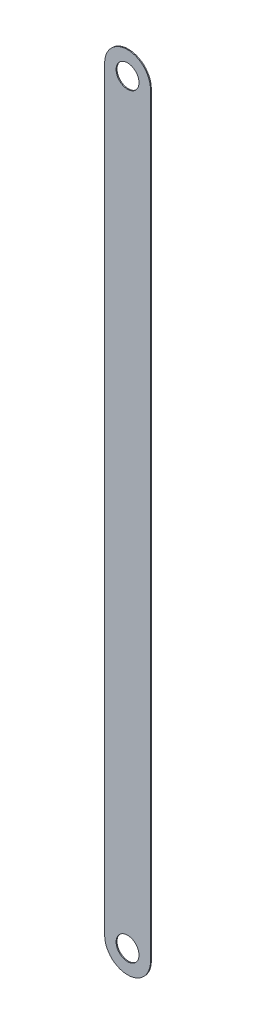
ISO-10303-21;
HEADER;
FILE_DESCRIPTION(('STEP AP214'),'2;1');
FILE_NAME('part.step','',(''),(''),'','','');
FILE_SCHEMA(('AUTOMOTIVE_DESIGN { 1 0 10303 214 1 1 1 1 }'));
ENDSEC;
DATA;
#1=APPLICATION_CONTEXT('core data for automotive mechanical design processes');
#2=APPLICATION_PROTOCOL_DEFINITION('international standard','automotive_design',2000,#1);
#3=PRODUCT_CONTEXT('',#1,'mechanical');
#4=PRODUCT('Part','Part','',(#3));
#5=PRODUCT_RELATED_PRODUCT_CATEGORY('part','',(#4));
#6=PRODUCT_DEFINITION_FORMATION('','',#4);
#7=PRODUCT_DEFINITION_CONTEXT('part definition',#1,'design');
#8=PRODUCT_DEFINITION('design','',#6,#7);
#9=PRODUCT_DEFINITION_SHAPE('','',#8);
#10=(LENGTH_UNIT() NAMED_UNIT(*) SI_UNIT(.MILLI.,.METRE.));
#11=(NAMED_UNIT(*) PLANE_ANGLE_UNIT() SI_UNIT($,.RADIAN.));
#12=(NAMED_UNIT(*) SI_UNIT($,.STERADIAN.) SOLID_ANGLE_UNIT());
#13=UNCERTAINTY_MEASURE_WITH_UNIT(LENGTH_MEASURE(1.E-05),#10,'distance_accuracy_value','');
#14=(GEOMETRIC_REPRESENTATION_CONTEXT(3) GLOBAL_UNCERTAINTY_ASSIGNED_CONTEXT((#13)) GLOBAL_UNIT_ASSIGNED_CONTEXT((#10,
#11,#12)) REPRESENTATION_CONTEXT('',''));
#15=CARTESIAN_POINT('',(0.,0.,0.));
#16=DIRECTION('',(0.,0.,1.));
#17=DIRECTION('',(1.,0.,0.));
#18=AXIS2_PLACEMENT_3D('',#15,#16,#17);
#19=CARTESIAN_POINT('',(0.,262.01608125,0.31759525));
#20=DIRECTION('',(0.,0.,1.));
#21=DIRECTION('',(1.,0.,0.));
#22=AXIS2_PLACEMENT_3D('',#19,#20,#21);
#23=PLANE('',#22);
#24=CARTESIAN_POINT('',(0.,262.01608125,0.31759525));
#25=DIRECTION('',(0.,0.,1.));
#26=DIRECTION('',(1.,0.,0.));
#27=AXIS2_PLACEMENT_3D('',#24,#25,#26);
#28=CIRCLE('',#27,4.76488124999999);
#29=CARTESIAN_POINT('',(4.76488124999998,262.01608125,0.31759525));
#30=VERTEX_POINT('',#29);
#31=EDGE_CURVE('E102',#30,#30,#28,.T.);
#32=ORIENTED_EDGE('',*,*,#31,.F.);
#33=EDGE_LOOP('',(#32));
#34=FACE_BOUND('',#33,.T.);
#35=CARTESIAN_POINT('',(0.,262.01608125,0.31759525));
#36=DIRECTION('',(0.,0.,1.));
#37=DIRECTION('',(1.,0.,0.));
#38=AXIS2_PLACEMENT_3D('',#35,#36,#37);
#39=CIRCLE('',#38,9.5297625);
#40=CARTESIAN_POINT('',(9.52976249999999,262.01608125,0.31759525));
#41=VERTEX_POINT('',#40);
#42=CARTESIAN_POINT('',(-9.52976250000001,262.01608125,0.31759525));
#43=VERTEX_POINT('',#42);
#44=EDGE_CURVE('E87',#41,#43,#39,.T.);
#45=ORIENTED_EDGE('',*,*,#44,.T.);
#46=DIRECTION('',(0.,-1.,0.));
#47=VECTOR('',#46,1.);
#48=CARTESIAN_POINT('',(-9.52976250000001,262.01608125,0.31759525));
#49=LINE('',#48,#47);
#50=CARTESIAN_POINT('',(-9.5297625,-52.46608125,0.31759525));
#51=VERTEX_POINT('',#50);
#52=EDGE_CURVE('E82',#43,#51,#49,.T.);
#53=ORIENTED_EDGE('',*,*,#52,.T.);
#54=CARTESIAN_POINT('',(0.,-52.46608125,0.31759525));
#55=DIRECTION('',(0.,0.,1.));
#56=DIRECTION('',(1.,0.,0.));
#57=AXIS2_PLACEMENT_3D('',#54,#55,#56);
#58=CIRCLE('',#57,9.5297625);
#59=CARTESIAN_POINT('',(9.5297625,-52.46608125,0.31759525));
#60=VERTEX_POINT('',#59);
#61=EDGE_CURVE('E85',#51,#60,#58,.T.);
#62=ORIENTED_EDGE('',*,*,#61,.T.);
#63=DIRECTION('',(0.,1.,0.));
#64=VECTOR('',#63,1.);
#65=CARTESIAN_POINT('',(9.52976249999999,262.01608125,0.31759525));
#66=LINE('',#65,#64);
#67=EDGE_CURVE('E52',#60,#41,#66,.T.);
#68=ORIENTED_EDGE('',*,*,#67,.T.);
#69=EDGE_LOOP('',(#45,#53,#62,#68));
#70=FACE_BOUND('',#69,.T.);
#71=CARTESIAN_POINT('',(0.,-52.46608125,0.31759525));
#72=DIRECTION('',(0.,0.,1.));
#73=DIRECTION('',(1.,0.,0.));
#74=AXIS2_PLACEMENT_3D('',#71,#72,#73);
#75=CIRCLE('',#74,4.76488125);
#76=CARTESIAN_POINT('',(4.76488125,-52.46608125,0.31759525));
#77=VERTEX_POINT('',#76);
#78=EDGE_CURVE('E117',#77,#77,#75,.T.);
#79=ORIENTED_EDGE('',*,*,#78,.F.);
#80=EDGE_LOOP('',(#79));
#81=FACE_BOUND('',#80,.T.);
#82=ADVANCED_FACE('F35',(#34,#70,#81),#23,.T.);
#83=CARTESIAN_POINT('',(0.,262.01608125,-0.06359525));
#84=DIRECTION('',(0.,0.,1.));
#85=DIRECTION('',(1.,0.,0.));
#86=AXIS2_PLACEMENT_3D('',#83,#84,#85);
#87=PLANE('',#86);
#88=CARTESIAN_POINT('',(0.,262.01608125,-0.06359525));
#89=DIRECTION('',(0.,0.,1.));
#90=DIRECTION('',(1.,0.,0.));
#91=AXIS2_PLACEMENT_3D('',#88,#89,#90);
#92=CIRCLE('',#91,9.5297625);
#93=CARTESIAN_POINT('',(9.52976249999999,262.01608125,-0.06359525));
#94=VERTEX_POINT('',#93);
#95=CARTESIAN_POINT('',(-9.52976250000001,262.01608125,-0.06359525));
#96=VERTEX_POINT('',#95);
#97=EDGE_CURVE('E99',#94,#96,#92,.T.);
#98=ORIENTED_EDGE('',*,*,#97,.F.);
#99=DIRECTION('',(0.,1.,0.));
#100=VECTOR('',#99,1.);
#101=CARTESIAN_POINT('',(9.52976249999999,262.01608125,-0.06359525));
#102=LINE('',#101,#100);
#103=CARTESIAN_POINT('',(9.5297625,-52.46608125,-0.06359525));
#104=VERTEX_POINT('',#103);
#105=EDGE_CURVE('E75',#104,#94,#102,.T.);
#106=ORIENTED_EDGE('',*,*,#105,.F.);
#107=CARTESIAN_POINT('',(0.,-52.46608125,-0.06359525));
#108=DIRECTION('',(0.,0.,1.));
#109=DIRECTION('',(1.,0.,0.));
#110=AXIS2_PLACEMENT_3D('',#107,#108,#109);
#111=CIRCLE('',#110,9.5297625);
#112=CARTESIAN_POINT('',(-9.5297625,-52.46608125,-0.06359525));
#113=VERTEX_POINT('',#112);
#114=EDGE_CURVE('E69',#113,#104,#111,.T.);
#115=ORIENTED_EDGE('',*,*,#114,.F.);
#116=DIRECTION('',(0.,-1.,0.));
#117=VECTOR('',#116,1.);
#118=CARTESIAN_POINT('',(-9.52976250000001,262.01608125,-0.06359525));
#119=LINE('',#118,#117);
#120=EDGE_CURVE('E91',#96,#113,#119,.T.);
#121=ORIENTED_EDGE('',*,*,#120,.F.);
#122=EDGE_LOOP('',(#98,#106,#115,#121));
#123=FACE_BOUND('',#122,.T.);
#124=CARTESIAN_POINT('',(0.,262.01608125,-0.06359525));
#125=DIRECTION('',(0.,0.,1.));
#126=DIRECTION('',(1.,0.,0.));
#127=AXIS2_PLACEMENT_3D('',#124,#125,#126);
#128=CIRCLE('',#127,4.76488124999999);
#129=CARTESIAN_POINT('',(4.76488124999998,262.01608125,-0.06359525));
#130=VERTEX_POINT('',#129);
#131=EDGE_CURVE('E114',#130,#130,#128,.T.);
#132=ORIENTED_EDGE('',*,*,#131,.T.);
#133=EDGE_LOOP('',(#132));
#134=FACE_BOUND('',#133,.T.);
#135=CARTESIAN_POINT('',(0.,-52.46608125,-0.06359525));
#136=DIRECTION('',(0.,0.,1.));
#137=DIRECTION('',(1.,0.,0.));
#138=AXIS2_PLACEMENT_3D('',#135,#136,#137);
#139=CIRCLE('',#138,4.76488125);
#140=CARTESIAN_POINT('',(4.76488125,-52.46608125,-0.06359525));
#141=VERTEX_POINT('',#140);
#142=EDGE_CURVE('E120',#141,#141,#139,.T.);
#143=ORIENTED_EDGE('',*,*,#142,.T.);
#144=EDGE_LOOP('',(#143));
#145=FACE_BOUND('',#144,.T.);
#146=ADVANCED_FACE('F110',(#123,#134,#145),#87,.F.);
#147=CARTESIAN_POINT('',(0.,262.01608125,0.31759525));
#148=DIRECTION('',(0.,0.,-1.));
#149=DIRECTION('',(-1.,0.,0.));
#150=AXIS2_PLACEMENT_3D('',#147,#148,#149);
#151=CYLINDRICAL_SURFACE('',#150,9.5297625);
#152=ORIENTED_EDGE('',*,*,#97,.T.);
#153=DIRECTION('',(0.,0.,-1.));
#154=VECTOR('',#153,1.);
#155=CARTESIAN_POINT('',(-9.52976250000001,262.01608125,0.31759525));
#156=LINE('',#155,#154);
#157=EDGE_CURVE('E11',#43,#96,#156,.T.);
#158=ORIENTED_EDGE('',*,*,#157,.F.);
#159=ORIENTED_EDGE('',*,*,#44,.F.);
#160=DIRECTION('',(0.,0.,-1.));
#161=VECTOR('',#160,1.);
#162=CARTESIAN_POINT('',(9.52976249999999,262.01608125,0.31759525));
#163=LINE('',#162,#161);
#164=EDGE_CURVE('E95',#41,#94,#163,.T.);
#165=ORIENTED_EDGE('',*,*,#164,.T.);
#166=EDGE_LOOP('',(#152,#158,#159,#165));
#167=FACE_BOUND('',#166,.T.);
#168=ADVANCED_FACE('F37',(#167),#151,.T.);
#169=CARTESIAN_POINT('',(-9.52976250000001,262.01608125,0.31759525));
#170=DIRECTION('',(1.,0.,0.));
#171=DIRECTION('',(0.,1.,0.));
#172=AXIS2_PLACEMENT_3D('',#169,#170,#171);
#173=PLANE('',#172);
#174=ORIENTED_EDGE('',*,*,#120,.T.);
#175=DIRECTION('',(0.,0.,-1.));
#176=VECTOR('',#175,1.);
#177=CARTESIAN_POINT('',(-9.5297625,-52.46608125,0.31759525));
#178=LINE('',#177,#176);
#179=EDGE_CURVE('E44',#51,#113,#178,.T.);
#180=ORIENTED_EDGE('',*,*,#179,.F.);
#181=ORIENTED_EDGE('',*,*,#52,.F.);
#182=ORIENTED_EDGE('',*,*,#157,.T.);
#183=EDGE_LOOP('',(#174,#180,#181,#182));
#184=FACE_BOUND('',#183,.T.);
#185=ADVANCED_FACE('F90',(#184),#173,.F.);
#186=CARTESIAN_POINT('',(0.,-52.46608125,0.31759525));
#187=DIRECTION('',(0.,0.,-1.));
#188=DIRECTION('',(-1.,0.,0.));
#189=AXIS2_PLACEMENT_3D('',#186,#187,#188);
#190=CYLINDRICAL_SURFACE('',#189,9.5297625);
#191=ORIENTED_EDGE('',*,*,#114,.T.);
#192=DIRECTION('',(0.,0.,-1.));
#193=VECTOR('',#192,1.);
#194=CARTESIAN_POINT('',(9.5297625,-52.46608125,0.31759525));
#195=LINE('',#194,#193);
#196=EDGE_CURVE('E92',#60,#104,#195,.T.);
#197=ORIENTED_EDGE('',*,*,#196,.F.);
#198=ORIENTED_EDGE('',*,*,#61,.F.);
#199=ORIENTED_EDGE('',*,*,#179,.T.);
#200=EDGE_LOOP('',(#191,#197,#198,#199));
#201=FACE_BOUND('',#200,.T.);
#202=ADVANCED_FACE('F93',(#201),#190,.T.);
#203=CARTESIAN_POINT('',(9.52976249999999,262.01608125,0.31759525));
#204=DIRECTION('',(-1.,0.,0.));
#205=DIRECTION('',(0.,-1.,0.));
#206=AXIS2_PLACEMENT_3D('',#203,#204,#205);
#207=PLANE('',#206);
#208=ORIENTED_EDGE('',*,*,#105,.T.);
#209=ORIENTED_EDGE('',*,*,#164,.F.);
#210=ORIENTED_EDGE('',*,*,#67,.F.);
#211=ORIENTED_EDGE('',*,*,#196,.T.);
#212=EDGE_LOOP('',(#208,#209,#210,#211));
#213=FACE_BOUND('',#212,.T.);
#214=ADVANCED_FACE('F107',(#213),#207,.F.);
#215=CARTESIAN_POINT('',(0.,262.01608125,0.31759525));
#216=DIRECTION('',(0.,0.,-1.));
#217=DIRECTION('',(-1.,0.,0.));
#218=AXIS2_PLACEMENT_3D('',#215,#216,#217);
#219=CYLINDRICAL_SURFACE('',#218,4.76488124999999);
#220=ORIENTED_EDGE('',*,*,#31,.T.);
#221=EDGE_LOOP('',(#220));
#222=FACE_BOUND('',#221,.T.);
#223=ORIENTED_EDGE('',*,*,#131,.F.);
#224=EDGE_LOOP('',(#223));
#225=FACE_BOUND('',#224,.T.);
#226=ADVANCED_FACE('F137',(#222,#225),#219,.F.);
#227=CARTESIAN_POINT('',(0.,-52.46608125,0.31759525));
#228=DIRECTION('',(0.,0.,-1.));
#229=DIRECTION('',(-1.,0.,0.));
#230=AXIS2_PLACEMENT_3D('',#227,#228,#229);
#231=CYLINDRICAL_SURFACE('',#230,4.76488125);
#232=ORIENTED_EDGE('',*,*,#78,.T.);
#233=EDGE_LOOP('',(#232));
#234=FACE_BOUND('',#233,.T.);
#235=ORIENTED_EDGE('',*,*,#142,.F.);
#236=EDGE_LOOP('',(#235));
#237=FACE_BOUND('',#236,.T.);
#238=ADVANCED_FACE('F126',(#234,#237),#231,.F.);
#239=CLOSED_SHELL('',(#82,#146,#168,#185,#202,#214,#226,#238));
#240=MANIFOLD_SOLID_BREP('B2',#239);
#241=ADVANCED_BREP_SHAPE_REPRESENTATION('',(#18,#240),#14);
#242=SHAPE_DEFINITION_REPRESENTATION(#9,#241);
ENDSEC;
END-ISO-10303-21;
